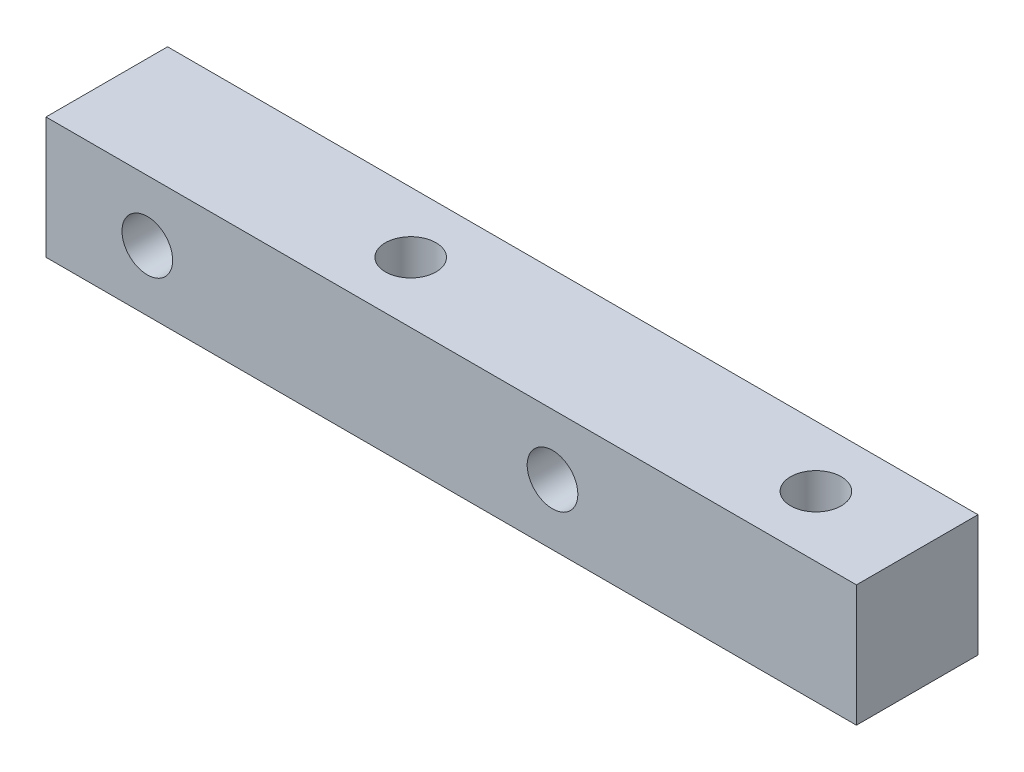
ISO-10303-21;
HEADER;
FILE_DESCRIPTION(('STEP AP214'),'2;1');
FILE_NAME('part.step','',(''),(''),'','','');
FILE_SCHEMA(('AUTOMOTIVE_DESIGN { 1 0 10303 214 1 1 1 1 }'));
ENDSEC;
DATA;
#1=APPLICATION_CONTEXT('core data for automotive mechanical design processes');
#2=APPLICATION_PROTOCOL_DEFINITION('international standard','automotive_design',2000,#1);
#3=PRODUCT_CONTEXT('',#1,'mechanical');
#4=PRODUCT('Part','Part','',(#3));
#5=PRODUCT_RELATED_PRODUCT_CATEGORY('part','',(#4));
#6=PRODUCT_DEFINITION_FORMATION('','',#4);
#7=PRODUCT_DEFINITION_CONTEXT('part definition',#1,'design');
#8=PRODUCT_DEFINITION('design','',#6,#7);
#9=PRODUCT_DEFINITION_SHAPE('','',#8);
#10=(LENGTH_UNIT() NAMED_UNIT(*) SI_UNIT(.MILLI.,.METRE.));
#11=(NAMED_UNIT(*) PLANE_ANGLE_UNIT() SI_UNIT($,.RADIAN.));
#12=(NAMED_UNIT(*) SI_UNIT($,.STERADIAN.) SOLID_ANGLE_UNIT());
#13=UNCERTAINTY_MEASURE_WITH_UNIT(LENGTH_MEASURE(1.E-05),#10,'distance_accuracy_value','');
#14=(GEOMETRIC_REPRESENTATION_CONTEXT(3) GLOBAL_UNCERTAINTY_ASSIGNED_CONTEXT((#13)) GLOBAL_UNIT_ASSIGNED_CONTEXT((#10,
#11,#12)) REPRESENTATION_CONTEXT('',''));
#15=CARTESIAN_POINT('',(0.,0.,0.));
#16=DIRECTION('',(0.,0.,1.));
#17=DIRECTION('',(1.,0.,0.));
#18=AXIS2_PLACEMENT_3D('',#15,#16,#17);
#19=CARTESIAN_POINT('',(20.,3.00000000000001,6.));
#20=DIRECTION('',(-1.,0.,0.));
#21=DIRECTION('',(0.,-1.,0.));
#22=AXIS2_PLACEMENT_3D('',#19,#20,#21);
#23=PLANE('',#22);
#24=DIRECTION('',(0.,1.,0.));
#25=VECTOR('',#24,1.);
#26=CARTESIAN_POINT('',(20.,3.00000000000001,0.));
#27=LINE('',#26,#25);
#28=CARTESIAN_POINT('',(20.,-3.,0.));
#29=VERTEX_POINT('',#28);
#30=CARTESIAN_POINT('',(20.,3.00000000000001,0.));
#31=VERTEX_POINT('',#30);
#32=EDGE_CURVE('E109',#29,#31,#27,.T.);
#33=ORIENTED_EDGE('',*,*,#32,.T.);
#34=DIRECTION('',(0.,0.,-1.));
#35=VECTOR('',#34,1.);
#36=CARTESIAN_POINT('',(20.,3.00000000000001,6.));
#37=LINE('',#36,#35);
#38=CARTESIAN_POINT('',(20.,3.00000000000001,6.));
#39=VERTEX_POINT('',#38);
#40=EDGE_CURVE('E11',#39,#31,#37,.T.);
#41=ORIENTED_EDGE('',*,*,#40,.F.);
#42=DIRECTION('',(0.,1.,0.));
#43=VECTOR('',#42,1.);
#44=CARTESIAN_POINT('',(20.,3.00000000000001,6.));
#45=LINE('',#44,#43);
#46=CARTESIAN_POINT('',(20.,-3.,6.));
#47=VERTEX_POINT('',#46);
#48=EDGE_CURVE('E96',#47,#39,#45,.T.);
#49=ORIENTED_EDGE('',*,*,#48,.F.);
#50=DIRECTION('',(0.,0.,-1.));
#51=VECTOR('',#50,1.);
#52=CARTESIAN_POINT('',(20.,-3.,6.));
#53=LINE('',#52,#51);
#54=EDGE_CURVE('E105',#47,#29,#53,.T.);
#55=ORIENTED_EDGE('',*,*,#54,.T.);
#56=EDGE_LOOP('',(#33,#41,#49,#55));
#57=FACE_BOUND('',#56,.T.);
#58=ADVANCED_FACE('F43',(#57),#23,.F.);
#59=CARTESIAN_POINT('',(-20.,3.,6.));
#60=DIRECTION('',(0.,-1.,0.));
#61=DIRECTION('',(1.,0.,0.));
#62=AXIS2_PLACEMENT_3D('',#59,#60,#61);
#63=PLANE('',#62);
#64=CARTESIAN_POINT('',(-5.,3.,3.));
#65=DIRECTION('',(0.,1.,0.));
#66=DIRECTION('',(0.,0.,1.));
#67=AXIS2_PLACEMENT_3D('',#64,#65,#66);
#68=CIRCLE('',#67,1.24999999999999);
#69=CARTESIAN_POINT('',(-5.,3.,4.24999999999999));
#70=VERTEX_POINT('',#69);
#71=EDGE_CURVE('E188',#70,#70,#68,.T.);
#72=ORIENTED_EDGE('',*,*,#71,.F.);
#73=EDGE_LOOP('',(#72));
#74=FACE_BOUND('',#73,.T.);
#75=CARTESIAN_POINT('',(15.,3.00000000000001,3.));
#76=DIRECTION('',(0.,1.,0.));
#77=DIRECTION('',(0.,0.,1.));
#78=AXIS2_PLACEMENT_3D('',#75,#76,#77);
#79=CIRCLE('',#78,1.24999999999999);
#80=CARTESIAN_POINT('',(15.,3.00000000000001,4.24999999999999));
#81=VERTEX_POINT('',#80);
#82=EDGE_CURVE('E131',#81,#81,#79,.T.);
#83=ORIENTED_EDGE('',*,*,#82,.F.);
#84=EDGE_LOOP('',(#83));
#85=FACE_BOUND('',#84,.T.);
#86=DIRECTION('',(-1.,0.,0.));
#87=VECTOR('',#86,1.);
#88=CARTESIAN_POINT('',(-20.,3.,0.));
#89=LINE('',#88,#87);
#90=CARTESIAN_POINT('',(-20.,3.,0.));
#91=VERTEX_POINT('',#90);
#92=EDGE_CURVE('E100',#31,#91,#89,.T.);
#93=ORIENTED_EDGE('',*,*,#92,.T.);
#94=DIRECTION('',(0.,0.,-1.));
#95=VECTOR('',#94,1.);
#96=CARTESIAN_POINT('',(-20.,3.,6.));
#97=LINE('',#96,#95);
#98=CARTESIAN_POINT('',(-20.,3.,6.));
#99=VERTEX_POINT('',#98);
#100=EDGE_CURVE('E52',#99,#91,#97,.T.);
#101=ORIENTED_EDGE('',*,*,#100,.F.);
#102=DIRECTION('',(-1.,0.,0.));
#103=VECTOR('',#102,1.);
#104=CARTESIAN_POINT('',(-20.,3.,6.));
#105=LINE('',#104,#103);
#106=EDGE_CURVE('E91',#39,#99,#105,.T.);
#107=ORIENTED_EDGE('',*,*,#106,.F.);
#108=ORIENTED_EDGE('',*,*,#40,.T.);
#109=EDGE_LOOP('',(#93,#101,#107,#108));
#110=FACE_BOUND('',#109,.T.);
#111=ADVANCED_FACE('F99',(#74,#85,#110),#63,.F.);
#112=CARTESIAN_POINT('',(-20.,3.,6.));
#113=DIRECTION('',(1.,0.,0.));
#114=DIRECTION('',(0.,1.,0.));
#115=AXIS2_PLACEMENT_3D('',#112,#113,#114);
#116=PLANE('',#115);
#117=DIRECTION('',(0.,-1.,0.));
#118=VECTOR('',#117,1.);
#119=CARTESIAN_POINT('',(-20.,3.,0.));
#120=LINE('',#119,#118);
#121=CARTESIAN_POINT('',(-20.,-3.,0.));
#122=VERTEX_POINT('',#121);
#123=EDGE_CURVE('E78',#91,#122,#120,.T.);
#124=ORIENTED_EDGE('',*,*,#123,.T.);
#125=DIRECTION('',(0.,0.,-1.));
#126=VECTOR('',#125,1.);
#127=CARTESIAN_POINT('',(-20.,-3.,6.));
#128=LINE('',#127,#126);
#129=CARTESIAN_POINT('',(-20.,-3.,6.));
#130=VERTEX_POINT('',#129);
#131=EDGE_CURVE('E101',#130,#122,#128,.T.);
#132=ORIENTED_EDGE('',*,*,#131,.F.);
#133=DIRECTION('',(0.,-1.,0.));
#134=VECTOR('',#133,1.);
#135=CARTESIAN_POINT('',(-20.,3.,6.));
#136=LINE('',#135,#134);
#137=EDGE_CURVE('E94',#99,#130,#136,.T.);
#138=ORIENTED_EDGE('',*,*,#137,.F.);
#139=ORIENTED_EDGE('',*,*,#100,.T.);
#140=EDGE_LOOP('',(#124,#132,#138,#139));
#141=FACE_BOUND('',#140,.T.);
#142=ADVANCED_FACE('F103',(#141),#116,.F.);
#143=CARTESIAN_POINT('',(-20.,-3.,6.));
#144=DIRECTION('',(0.,1.,0.));
#145=DIRECTION('',(-1.,0.,0.));
#146=AXIS2_PLACEMENT_3D('',#143,#144,#145);
#147=PLANE('',#146);
#148=CARTESIAN_POINT('',(-5.,-3.,3.));
#149=DIRECTION('',(0.,1.,0.));
#150=DIRECTION('',(-1.,0.,0.));
#151=AXIS2_PLACEMENT_3D('',#148,#149,#150);
#152=CIRCLE('',#151,1.24999999999999);
#153=CARTESIAN_POINT('',(-6.24999999999999,-3.,3.));
#154=VERTEX_POINT('',#153);
#155=EDGE_CURVE('E46',#154,#154,#152,.T.);
#156=ORIENTED_EDGE('',*,*,#155,.T.);
#157=EDGE_LOOP('',(#156));
#158=FACE_BOUND('',#157,.T.);
#159=CARTESIAN_POINT('',(15.,-3.,3.));
#160=DIRECTION('',(0.,1.,0.));
#161=DIRECTION('',(-1.,0.,0.));
#162=AXIS2_PLACEMENT_3D('',#159,#160,#161);
#163=CIRCLE('',#162,1.24999999999999);
#164=CARTESIAN_POINT('',(13.75,-3.,3.));
#165=VERTEX_POINT('',#164);
#166=EDGE_CURVE('E126',#165,#165,#163,.T.);
#167=ORIENTED_EDGE('',*,*,#166,.T.);
#168=EDGE_LOOP('',(#167));
#169=FACE_BOUND('',#168,.T.);
#170=DIRECTION('',(1.,0.,0.));
#171=VECTOR('',#170,1.);
#172=CARTESIAN_POINT('',(-20.,-3.,0.));
#173=LINE('',#172,#171);
#174=EDGE_CURVE('E84',#122,#29,#173,.T.);
#175=ORIENTED_EDGE('',*,*,#174,.T.);
#176=ORIENTED_EDGE('',*,*,#54,.F.);
#177=DIRECTION('',(1.,0.,0.));
#178=VECTOR('',#177,1.);
#179=CARTESIAN_POINT('',(-20.,-3.,6.));
#180=LINE('',#179,#178);
#181=EDGE_CURVE('E61',#130,#47,#180,.T.);
#182=ORIENTED_EDGE('',*,*,#181,.F.);
#183=ORIENTED_EDGE('',*,*,#131,.T.);
#184=EDGE_LOOP('',(#175,#176,#182,#183));
#185=FACE_BOUND('',#184,.T.);
#186=ADVANCED_FACE('F162',(#158,#169,#185),#147,.F.);
#187=CARTESIAN_POINT('',(0.,0.,6.));
#188=DIRECTION('',(0.,0.,1.));
#189=DIRECTION('',(1.,0.,0.));
#190=AXIS2_PLACEMENT_3D('',#187,#188,#189);
#191=PLANE('',#190);
#192=CARTESIAN_POINT('',(-15.,0.,6.));
#193=DIRECTION('',(0.,0.,1.));
#194=DIRECTION('',(1.,0.,0.));
#195=AXIS2_PLACEMENT_3D('',#192,#193,#194);
#196=CIRCLE('',#195,1.24999999999999);
#197=CARTESIAN_POINT('',(-13.75,0.,6.));
#198=VERTEX_POINT('',#197);
#199=EDGE_CURVE('E120',#198,#198,#196,.T.);
#200=ORIENTED_EDGE('',*,*,#199,.F.);
#201=EDGE_LOOP('',(#200));
#202=FACE_BOUND('',#201,.T.);
#203=CARTESIAN_POINT('',(5.,0.,6.));
#204=DIRECTION('',(0.,0.,1.));
#205=DIRECTION('',(1.,0.,0.));
#206=AXIS2_PLACEMENT_3D('',#203,#204,#205);
#207=CIRCLE('',#206,1.24999999999999);
#208=CARTESIAN_POINT('',(6.24999999999999,0.,6.));
#209=VERTEX_POINT('',#208);
#210=EDGE_CURVE('E119',#209,#209,#207,.T.);
#211=ORIENTED_EDGE('',*,*,#210,.F.);
#212=EDGE_LOOP('',(#211));
#213=FACE_BOUND('',#212,.T.);
#214=ORIENTED_EDGE('',*,*,#48,.T.);
#215=ORIENTED_EDGE('',*,*,#106,.T.);
#216=ORIENTED_EDGE('',*,*,#137,.T.);
#217=ORIENTED_EDGE('',*,*,#181,.T.);
#218=EDGE_LOOP('',(#214,#215,#216,#217));
#219=FACE_BOUND('',#218,.T.);
#220=ADVANCED_FACE('F92',(#202,#213,#219),#191,.T.);
#221=CARTESIAN_POINT('',(0.,0.,0.));
#222=DIRECTION('',(0.,0.,1.));
#223=DIRECTION('',(1.,0.,0.));
#224=AXIS2_PLACEMENT_3D('',#221,#222,#223);
#225=PLANE('',#224);
#226=CARTESIAN_POINT('',(-15.,0.,0.));
#227=DIRECTION('',(0.,0.,1.));
#228=DIRECTION('',(1.,0.,0.));
#229=AXIS2_PLACEMENT_3D('',#226,#227,#228);
#230=CIRCLE('',#229,1.24999999999999);
#231=CARTESIAN_POINT('',(-13.75,0.,0.));
#232=VERTEX_POINT('',#231);
#233=EDGE_CURVE('E117',#232,#232,#230,.T.);
#234=ORIENTED_EDGE('',*,*,#233,.T.);
#235=EDGE_LOOP('',(#234));
#236=FACE_BOUND('',#235,.T.);
#237=CARTESIAN_POINT('',(5.,0.,0.));
#238=DIRECTION('',(0.,0.,1.));
#239=DIRECTION('',(1.,0.,0.));
#240=AXIS2_PLACEMENT_3D('',#237,#238,#239);
#241=CIRCLE('',#240,1.24999999999999);
#242=CARTESIAN_POINT('',(6.24999999999999,0.,0.));
#243=VERTEX_POINT('',#242);
#244=EDGE_CURVE('E112',#243,#243,#241,.T.);
#245=ORIENTED_EDGE('',*,*,#244,.T.);
#246=EDGE_LOOP('',(#245));
#247=FACE_BOUND('',#246,.T.);
#248=ORIENTED_EDGE('',*,*,#32,.F.);
#249=ORIENTED_EDGE('',*,*,#174,.F.);
#250=ORIENTED_EDGE('',*,*,#123,.F.);
#251=ORIENTED_EDGE('',*,*,#92,.F.);
#252=EDGE_LOOP('',(#248,#249,#250,#251));
#253=FACE_BOUND('',#252,.T.);
#254=ADVANCED_FACE('F138',(#236,#247,#253),#225,.F.);
#255=CARTESIAN_POINT('',(5.,0.,6.));
#256=DIRECTION('',(0.,0.,1.));
#257=DIRECTION('',(1.,0.,0.));
#258=AXIS2_PLACEMENT_3D('',#255,#256,#257);
#259=CYLINDRICAL_SURFACE('',#258,1.24999999999999);
#260=ORIENTED_EDGE('',*,*,#210,.T.);
#261=EDGE_LOOP('',(#260));
#262=FACE_BOUND('',#261,.T.);
#263=ORIENTED_EDGE('',*,*,#244,.F.);
#264=EDGE_LOOP('',(#263));
#265=FACE_BOUND('',#264,.T.);
#266=ADVANCED_FACE('F141',(#262,#265),#259,.F.);
#267=CARTESIAN_POINT('',(-15.,0.,6.));
#268=DIRECTION('',(0.,0.,1.));
#269=DIRECTION('',(1.,0.,0.));
#270=AXIS2_PLACEMENT_3D('',#267,#268,#269);
#271=CYLINDRICAL_SURFACE('',#270,1.24999999999999);
#272=ORIENTED_EDGE('',*,*,#199,.T.);
#273=EDGE_LOOP('',(#272));
#274=FACE_BOUND('',#273,.T.);
#275=ORIENTED_EDGE('',*,*,#233,.F.);
#276=EDGE_LOOP('',(#275));
#277=FACE_BOUND('',#276,.T.);
#278=ADVANCED_FACE('F143',(#274,#277),#271,.F.);
#279=CARTESIAN_POINT('',(15.,3.00000000000001,3.));
#280=DIRECTION('',(0.,1.,0.));
#281=DIRECTION('',(0.,0.,1.));
#282=AXIS2_PLACEMENT_3D('',#279,#280,#281);
#283=CYLINDRICAL_SURFACE('',#282,1.24999999999999);
#284=ORIENTED_EDGE('',*,*,#82,.T.);
#285=EDGE_LOOP('',(#284));
#286=FACE_BOUND('',#285,.T.);
#287=ORIENTED_EDGE('',*,*,#166,.F.);
#288=EDGE_LOOP('',(#287));
#289=FACE_BOUND('',#288,.T.);
#290=ADVANCED_FACE('F149',(#286,#289),#283,.F.);
#291=CARTESIAN_POINT('',(-5.,3.,3.));
#292=DIRECTION('',(0.,1.,0.));
#293=DIRECTION('',(0.,0.,1.));
#294=AXIS2_PLACEMENT_3D('',#291,#292,#293);
#295=CYLINDRICAL_SURFACE('',#294,1.24999999999999);
#296=ORIENTED_EDGE('',*,*,#71,.T.);
#297=EDGE_LOOP('',(#296));
#298=FACE_BOUND('',#297,.T.);
#299=ORIENTED_EDGE('',*,*,#155,.F.);
#300=EDGE_LOOP('',(#299));
#301=FACE_BOUND('',#300,.T.);
#302=ADVANCED_FACE('F178',(#298,#301),#295,.F.);
#303=CLOSED_SHELL('',(#58,#111,#142,#186,#220,#254,#266,#278,#290,#302));
#304=MANIFOLD_SOLID_BREP('B2',#303);
#305=ADVANCED_BREP_SHAPE_REPRESENTATION('',(#18,#304),#14);
#306=SHAPE_DEFINITION_REPRESENTATION(#9,#305);
ENDSEC;
END-ISO-10303-21;
